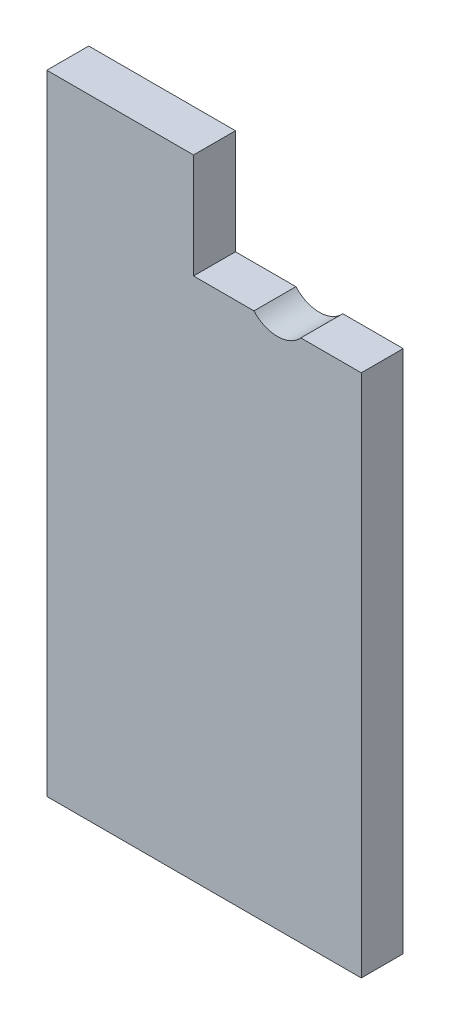
ISO-10303-21;
HEADER;
FILE_DESCRIPTION(('STEP AP214'),'2;1');
FILE_NAME('part.step','',(''),(''),'','','');
FILE_SCHEMA(('AUTOMOTIVE_DESIGN { 1 0 10303 214 1 1 1 1 }'));
ENDSEC;
DATA;
#1=APPLICATION_CONTEXT('core data for automotive mechanical design processes');
#2=APPLICATION_PROTOCOL_DEFINITION('international standard','automotive_design',2000,#1);
#3=PRODUCT_CONTEXT('',#1,'mechanical');
#4=PRODUCT('Part','Part','',(#3));
#5=PRODUCT_RELATED_PRODUCT_CATEGORY('part','',(#4));
#6=PRODUCT_DEFINITION_FORMATION('','',#4);
#7=PRODUCT_DEFINITION_CONTEXT('part definition',#1,'design');
#8=PRODUCT_DEFINITION('design','',#6,#7);
#9=PRODUCT_DEFINITION_SHAPE('','',#8);
#10=(LENGTH_UNIT() NAMED_UNIT(*) SI_UNIT(.MILLI.,.METRE.));
#11=(NAMED_UNIT(*) PLANE_ANGLE_UNIT() SI_UNIT($,.RADIAN.));
#12=(NAMED_UNIT(*) SI_UNIT($,.STERADIAN.) SOLID_ANGLE_UNIT());
#13=UNCERTAINTY_MEASURE_WITH_UNIT(LENGTH_MEASURE(1.E-05),#10,'distance_accuracy_value','');
#14=(GEOMETRIC_REPRESENTATION_CONTEXT(3) GLOBAL_UNCERTAINTY_ASSIGNED_CONTEXT((#13)) GLOBAL_UNIT_ASSIGNED_CONTEXT((#10,
#11,#12)) REPRESENTATION_CONTEXT('',''));
#15=CARTESIAN_POINT('',(0.,0.,0.));
#16=DIRECTION('',(0.,0.,1.));
#17=DIRECTION('',(1.,0.,0.));
#18=AXIS2_PLACEMENT_3D('',#15,#16,#17);
#19=CARTESIAN_POINT('',(0.,0.,2.));
#20=DIRECTION('',(1.,0.,0.));
#21=DIRECTION('',(0.,0.,-1.));
#22=AXIS2_PLACEMENT_3D('',#19,#20,#21);
#23=PLANE('',#22);
#24=DIRECTION('',(0.,-1.,0.));
#25=VECTOR('',#24,1.);
#26=CARTESIAN_POINT('',(0.,0.,0.));
#27=LINE('',#26,#25);
#28=CARTESIAN_POINT('',(0.,30.,0.));
#29=VERTEX_POINT('',#28);
#30=CARTESIAN_POINT('',(0.,0.,0.));
#31=VERTEX_POINT('',#30);
#32=EDGE_CURVE('E140',#29,#31,#27,.T.);
#33=ORIENTED_EDGE('',*,*,#32,.T.);
#34=DIRECTION('',(0.,0.,-1.));
#35=VECTOR('',#34,1.);
#36=CARTESIAN_POINT('',(0.,0.,2.));
#37=LINE('',#36,#35);
#38=CARTESIAN_POINT('',(0.,0.,2.));
#39=VERTEX_POINT('',#38);
#40=EDGE_CURVE('E11',#39,#31,#37,.T.);
#41=ORIENTED_EDGE('',*,*,#40,.F.);
#42=DIRECTION('',(0.,-1.,0.));
#43=VECTOR('',#42,1.);
#44=CARTESIAN_POINT('',(0.,0.,2.));
#45=LINE('',#44,#43);
#46=CARTESIAN_POINT('',(0.,30.,2.));
#47=VERTEX_POINT('',#46);
#48=EDGE_CURVE('E162',#47,#39,#45,.T.);
#49=ORIENTED_EDGE('',*,*,#48,.F.);
#50=DIRECTION('',(0.,0.,-1.));
#51=VECTOR('',#50,1.);
#52=CARTESIAN_POINT('',(0.,30.,2.));
#53=LINE('',#52,#51);
#54=EDGE_CURVE('E136',#47,#29,#53,.T.);
#55=ORIENTED_EDGE('',*,*,#54,.T.);
#56=EDGE_LOOP('',(#33,#41,#49,#55));
#57=FACE_BOUND('',#56,.T.);
#58=ADVANCED_FACE('F39',(#57),#23,.F.);
#59=CARTESIAN_POINT('',(0.,0.,2.));
#60=DIRECTION('',(0.,1.,0.));
#61=DIRECTION('',(0.,0.,1.));
#62=AXIS2_PLACEMENT_3D('',#59,#60,#61);
#63=PLANE('',#62);
#64=DIRECTION('',(1.,0.,0.));
#65=VECTOR('',#64,1.);
#66=CARTESIAN_POINT('',(0.,0.,0.));
#67=LINE('',#66,#65);
#68=CARTESIAN_POINT('',(15.,0.,0.));
#69=VERTEX_POINT('',#68);
#70=EDGE_CURVE('E144',#31,#69,#67,.T.);
#71=ORIENTED_EDGE('',*,*,#70,.T.);
#72=DIRECTION('',(0.,0.,-1.));
#73=VECTOR('',#72,1.);
#74=CARTESIAN_POINT('',(15.,0.,2.));
#75=LINE('',#74,#73);
#76=CARTESIAN_POINT('',(15.,0.,2.));
#77=VERTEX_POINT('',#76);
#78=EDGE_CURVE('E48',#77,#69,#75,.T.);
#79=ORIENTED_EDGE('',*,*,#78,.F.);
#80=DIRECTION('',(1.,0.,0.));
#81=VECTOR('',#80,1.);
#82=CARTESIAN_POINT('',(0.,0.,2.));
#83=LINE('',#82,#81);
#84=EDGE_CURVE('E99',#39,#77,#83,.T.);
#85=ORIENTED_EDGE('',*,*,#84,.F.);
#86=ORIENTED_EDGE('',*,*,#40,.T.);
#87=EDGE_LOOP('',(#71,#79,#85,#86));
#88=FACE_BOUND('',#87,.T.);
#89=ADVANCED_FACE('F208',(#88),#63,.F.);
#90=CARTESIAN_POINT('',(15.,0.,2.));
#91=DIRECTION('',(-1.,0.,0.));
#92=DIRECTION('',(0.,0.,1.));
#93=AXIS2_PLACEMENT_3D('',#90,#91,#92);
#94=PLANE('',#93);
#95=DIRECTION('',(0.,1.,0.));
#96=VECTOR('',#95,1.);
#97=CARTESIAN_POINT('',(15.,0.,0.));
#98=LINE('',#97,#96);
#99=CARTESIAN_POINT('',(15.,25.,0.));
#100=VERTEX_POINT('',#99);
#101=EDGE_CURVE('E147',#69,#100,#98,.T.);
#102=ORIENTED_EDGE('',*,*,#101,.T.);
#103=DIRECTION('',(0.,0.,-1.));
#104=VECTOR('',#103,1.);
#105=CARTESIAN_POINT('',(15.,25.,2.));
#106=LINE('',#105,#104);
#107=CARTESIAN_POINT('',(15.,25.,2.));
#108=VERTEX_POINT('',#107);
#109=EDGE_CURVE('E173',#108,#100,#106,.T.);
#110=ORIENTED_EDGE('',*,*,#109,.F.);
#111=DIRECTION('',(0.,1.,0.));
#112=VECTOR('',#111,1.);
#113=CARTESIAN_POINT('',(15.,0.,2.));
#114=LINE('',#113,#112);
#115=EDGE_CURVE('E183',#77,#108,#114,.T.);
#116=ORIENTED_EDGE('',*,*,#115,.F.);
#117=ORIENTED_EDGE('',*,*,#78,.T.);
#118=EDGE_LOOP('',(#102,#110,#116,#117));
#119=FACE_BOUND('',#118,.T.);
#120=ADVANCED_FACE('F181',(#119),#94,.F.);
#121=CARTESIAN_POINT('',(15.,25.,2.));
#122=DIRECTION('',(0.,-1.,0.));
#123=DIRECTION('',(0.,0.,-1.));
#124=AXIS2_PLACEMENT_3D('',#121,#122,#123);
#125=PLANE('',#124);
#126=DIRECTION('',(-1.,0.,0.));
#127=VECTOR('',#126,1.);
#128=CARTESIAN_POINT('',(15.,25.,0.));
#129=LINE('',#128,#127);
#130=CARTESIAN_POINT('',(12.1180339887499,25.,0.));
#131=VERTEX_POINT('',#130);
#132=EDGE_CURVE('E150',#100,#131,#129,.T.);
#133=ORIENTED_EDGE('',*,*,#132,.T.);
#134=DIRECTION('',(0.,0.,-1.));
#135=VECTOR('',#134,1.);
#136=CARTESIAN_POINT('',(12.1180339887499,25.,2.));
#137=LINE('',#136,#135);
#138=CARTESIAN_POINT('',(12.1180339887499,25.,2.));
#139=VERTEX_POINT('',#138);
#140=EDGE_CURVE('E169',#139,#131,#137,.T.);
#141=ORIENTED_EDGE('',*,*,#140,.F.);
#142=DIRECTION('',(-1.,0.,0.));
#143=VECTOR('',#142,1.);
#144=CARTESIAN_POINT('',(15.,25.,2.));
#145=LINE('',#144,#143);
#146=EDGE_CURVE('E196',#108,#139,#145,.T.);
#147=ORIENTED_EDGE('',*,*,#146,.F.);
#148=ORIENTED_EDGE('',*,*,#109,.T.);
#149=EDGE_LOOP('',(#133,#141,#147,#148));
#150=FACE_BOUND('',#149,.T.);
#151=ADVANCED_FACE('F191',(#150),#125,.F.);
#152=CARTESIAN_POINT('',(11.,26.,2.));
#153=DIRECTION('',(0.,0.,-1.));
#154=DIRECTION('',(-1.,0.,0.));
#155=AXIS2_PLACEMENT_3D('',#152,#153,#154);
#156=CYLINDRICAL_SURFACE('',#155,1.5);
#157=CARTESIAN_POINT('',(11.,26.,0.));
#158=DIRECTION('',(0.,0.,-1.));
#159=DIRECTION('',(1.,0.,0.));
#160=AXIS2_PLACEMENT_3D('',#157,#158,#159);
#161=CIRCLE('',#160,1.5);
#162=CARTESIAN_POINT('',(9.8819660112501,25.,0.));
#163=VERTEX_POINT('',#162);
#164=EDGE_CURVE('E153',#131,#163,#161,.T.);
#165=ORIENTED_EDGE('',*,*,#164,.T.);
#166=DIRECTION('',(0.,0.,-1.));
#167=VECTOR('',#166,1.);
#168=CARTESIAN_POINT('',(9.8819660112501,25.,2.));
#169=LINE('',#168,#167);
#170=CARTESIAN_POINT('',(9.8819660112501,25.,2.));
#171=VERTEX_POINT('',#170);
#172=EDGE_CURVE('E129',#171,#163,#169,.T.);
#173=ORIENTED_EDGE('',*,*,#172,.F.);
#174=CARTESIAN_POINT('',(11.,26.,2.));
#175=DIRECTION('',(0.,0.,-1.));
#176=DIRECTION('',(1.,0.,0.));
#177=AXIS2_PLACEMENT_3D('',#174,#175,#176);
#178=CIRCLE('',#177,1.5);
#179=EDGE_CURVE('E118',#139,#171,#178,.T.);
#180=ORIENTED_EDGE('',*,*,#179,.F.);
#181=ORIENTED_EDGE('',*,*,#140,.T.);
#182=EDGE_LOOP('',(#165,#173,#180,#181));
#183=FACE_BOUND('',#182,.T.);
#184=ADVANCED_FACE('F194',(#183),#156,.F.);
#185=CARTESIAN_POINT('',(9.8819660112501,25.,2.));
#186=DIRECTION('',(0.,-1.,0.));
#187=DIRECTION('',(0.,0.,-1.));
#188=AXIS2_PLACEMENT_3D('',#185,#186,#187);
#189=PLANE('',#188);
#190=DIRECTION('',(-1.,0.,0.));
#191=VECTOR('',#190,1.);
#192=CARTESIAN_POINT('',(9.8819660112501,25.,0.));
#193=LINE('',#192,#191);
#194=CARTESIAN_POINT('',(7.,25.,0.));
#195=VERTEX_POINT('',#194);
#196=EDGE_CURVE('E127',#163,#195,#193,.T.);
#197=ORIENTED_EDGE('',*,*,#196,.T.);
#198=DIRECTION('',(0.,0.,-1.));
#199=VECTOR('',#198,1.);
#200=CARTESIAN_POINT('',(7.,25.,2.));
#201=LINE('',#200,#199);
#202=CARTESIAN_POINT('',(7.,25.,2.));
#203=VERTEX_POINT('',#202);
#204=EDGE_CURVE('E124',#203,#195,#201,.T.);
#205=ORIENTED_EDGE('',*,*,#204,.F.);
#206=DIRECTION('',(-1.,0.,0.));
#207=VECTOR('',#206,1.);
#208=CARTESIAN_POINT('',(9.8819660112501,25.,2.));
#209=LINE('',#208,#207);
#210=EDGE_CURVE('E112',#171,#203,#209,.T.);
#211=ORIENTED_EDGE('',*,*,#210,.F.);
#212=ORIENTED_EDGE('',*,*,#172,.T.);
#213=EDGE_LOOP('',(#197,#205,#211,#212));
#214=FACE_BOUND('',#213,.T.);
#215=ADVANCED_FACE('F125',(#214),#189,.F.);
#216=CARTESIAN_POINT('',(7.,30.,2.));
#217=DIRECTION('',(-1.,0.,0.));
#218=DIRECTION('',(0.,-1.,0.));
#219=AXIS2_PLACEMENT_3D('',#216,#217,#218);
#220=PLANE('',#219);
#221=DIRECTION('',(0.,1.,0.));
#222=VECTOR('',#221,1.);
#223=CARTESIAN_POINT('',(7.,30.,0.));
#224=LINE('',#223,#222);
#225=CARTESIAN_POINT('',(7.,30.,0.));
#226=VERTEX_POINT('',#225);
#227=EDGE_CURVE('E85',#195,#226,#224,.T.);
#228=ORIENTED_EDGE('',*,*,#227,.T.);
#229=DIRECTION('',(0.,0.,-1.));
#230=VECTOR('',#229,1.);
#231=CARTESIAN_POINT('',(7.,30.,2.));
#232=LINE('',#231,#230);
#233=CARTESIAN_POINT('',(7.,30.,2.));
#234=VERTEX_POINT('',#233);
#235=EDGE_CURVE('E130',#234,#226,#232,.T.);
#236=ORIENTED_EDGE('',*,*,#235,.F.);
#237=DIRECTION('',(0.,1.,0.));
#238=VECTOR('',#237,1.);
#239=CARTESIAN_POINT('',(7.,30.,2.));
#240=LINE('',#239,#238);
#241=EDGE_CURVE('E116',#203,#234,#240,.T.);
#242=ORIENTED_EDGE('',*,*,#241,.F.);
#243=ORIENTED_EDGE('',*,*,#204,.T.);
#244=EDGE_LOOP('',(#228,#236,#242,#243));
#245=FACE_BOUND('',#244,.T.);
#246=ADVANCED_FACE('F132',(#245),#220,.F.);
#247=CARTESIAN_POINT('',(0.,30.,2.));
#248=DIRECTION('',(0.,-1.,0.));
#249=DIRECTION('',(0.,0.,-1.));
#250=AXIS2_PLACEMENT_3D('',#247,#248,#249);
#251=PLANE('',#250);
#252=DIRECTION('',(-1.,0.,0.));
#253=VECTOR('',#252,1.);
#254=CARTESIAN_POINT('',(0.,30.,0.));
#255=LINE('',#254,#253);
#256=EDGE_CURVE('E91',#226,#29,#255,.T.);
#257=ORIENTED_EDGE('',*,*,#256,.T.);
#258=ORIENTED_EDGE('',*,*,#54,.F.);
#259=DIRECTION('',(-1.,0.,0.));
#260=VECTOR('',#259,1.);
#261=CARTESIAN_POINT('',(0.,30.,2.));
#262=LINE('',#261,#260);
#263=EDGE_CURVE('E56',#234,#47,#262,.T.);
#264=ORIENTED_EDGE('',*,*,#263,.F.);
#265=ORIENTED_EDGE('',*,*,#235,.T.);
#266=EDGE_LOOP('',(#257,#258,#264,#265));
#267=FACE_BOUND('',#266,.T.);
#268=ADVANCED_FACE('F224',(#267),#251,.F.);
#269=CARTESIAN_POINT('',(11.,26.,2.));
#270=DIRECTION('',(0.,0.,1.));
#271=DIRECTION('',(1.,0.,0.));
#272=AXIS2_PLACEMENT_3D('',#269,#270,#271);
#273=PLANE('',#272);
#274=ORIENTED_EDGE('',*,*,#48,.T.);
#275=ORIENTED_EDGE('',*,*,#84,.T.);
#276=ORIENTED_EDGE('',*,*,#115,.T.);
#277=ORIENTED_EDGE('',*,*,#146,.T.);
#278=ORIENTED_EDGE('',*,*,#179,.T.);
#279=ORIENTED_EDGE('',*,*,#210,.T.);
#280=ORIENTED_EDGE('',*,*,#241,.T.);
#281=ORIENTED_EDGE('',*,*,#263,.T.);
#282=EDGE_LOOP('',(#274,#275,#276,#277,#278,#279,#280,#281));
#283=FACE_BOUND('',#282,.T.);
#284=ADVANCED_FACE('F114',(#283),#273,.T.);
#285=CARTESIAN_POINT('',(11.,26.,0.));
#286=DIRECTION('',(0.,0.,1.));
#287=DIRECTION('',(1.,0.,0.));
#288=AXIS2_PLACEMENT_3D('',#285,#286,#287);
#289=PLANE('',#288);
#290=ORIENTED_EDGE('',*,*,#32,.F.);
#291=ORIENTED_EDGE('',*,*,#256,.F.);
#292=ORIENTED_EDGE('',*,*,#227,.F.);
#293=ORIENTED_EDGE('',*,*,#196,.F.);
#294=ORIENTED_EDGE('',*,*,#164,.F.);
#295=ORIENTED_EDGE('',*,*,#132,.F.);
#296=ORIENTED_EDGE('',*,*,#101,.F.);
#297=ORIENTED_EDGE('',*,*,#70,.F.);
#298=EDGE_LOOP('',(#290,#291,#292,#293,#294,#295,#296,#297));
#299=FACE_BOUND('',#298,.T.);
#300=ADVANCED_FACE('F187',(#299),#289,.F.);
#301=CLOSED_SHELL('',(#58,#89,#120,#151,#184,#215,#246,#268,#284,#300));
#302=MANIFOLD_SOLID_BREP('B2',#301);
#303=ADVANCED_BREP_SHAPE_REPRESENTATION('',(#18,#302),#14);
#304=SHAPE_DEFINITION_REPRESENTATION(#9,#303);
ENDSEC;
END-ISO-10303-21;
